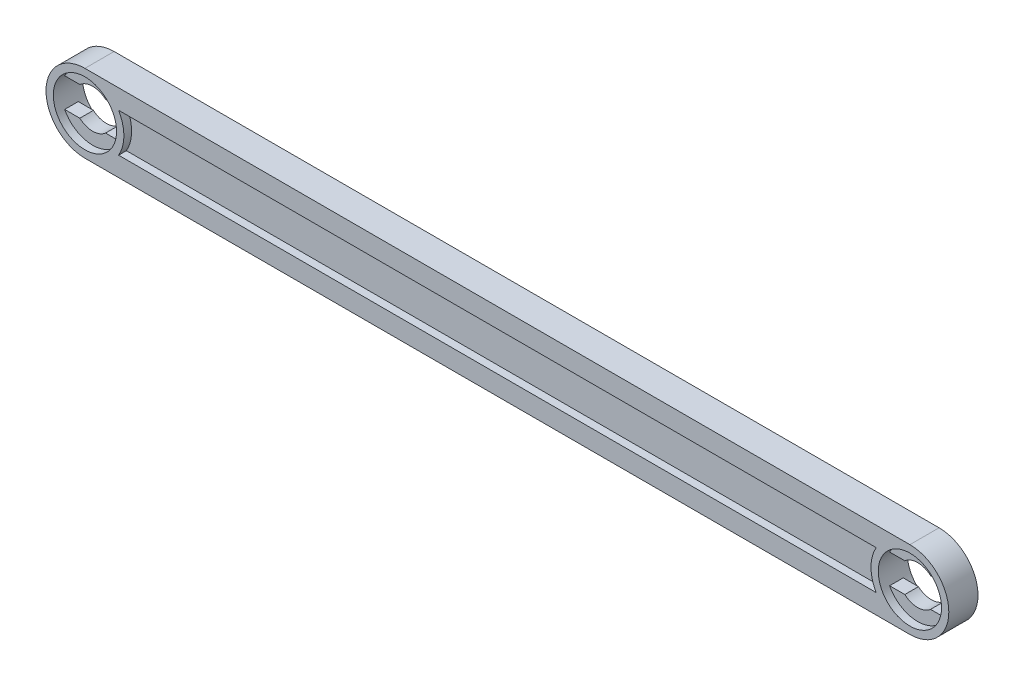
ISO-10303-21;
HEADER;
FILE_DESCRIPTION(('STEP AP214'),'2;1');
FILE_NAME('part.step','',(''),(''),'','','');
FILE_SCHEMA(('AUTOMOTIVE_DESIGN { 1 0 10303 214 1 1 1 1 }'));
ENDSEC;
DATA;
#1=APPLICATION_CONTEXT('core data for automotive mechanical design processes');
#2=APPLICATION_PROTOCOL_DEFINITION('international standard','automotive_design',2000,#1);
#3=PRODUCT_CONTEXT('',#1,'mechanical');
#4=PRODUCT('Part','Part','',(#3));
#5=PRODUCT_RELATED_PRODUCT_CATEGORY('part','',(#4));
#6=PRODUCT_DEFINITION_FORMATION('','',#4);
#7=PRODUCT_DEFINITION_CONTEXT('part definition',#1,'design');
#8=PRODUCT_DEFINITION('design','',#6,#7);
#9=PRODUCT_DEFINITION_SHAPE('','',#8);
#10=(LENGTH_UNIT() NAMED_UNIT(*) SI_UNIT(.MILLI.,.METRE.));
#11=(NAMED_UNIT(*) PLANE_ANGLE_UNIT() SI_UNIT($,.RADIAN.));
#12=(NAMED_UNIT(*) SI_UNIT($,.STERADIAN.) SOLID_ANGLE_UNIT());
#13=UNCERTAINTY_MEASURE_WITH_UNIT(LENGTH_MEASURE(1.E-05),#10,'distance_accuracy_value','');
#14=(GEOMETRIC_REPRESENTATION_CONTEXT(3) GLOBAL_UNCERTAINTY_ASSIGNED_CONTEXT((#13)) GLOBAL_UNIT_ASSIGNED_CONTEXT((#10,
#11,#12)) REPRESENTATION_CONTEXT('',''));
#15=CARTESIAN_POINT('',(0.,0.,0.));
#16=DIRECTION('',(0.,0.,1.));
#17=DIRECTION('',(1.,0.,0.));
#18=AXIS2_PLACEMENT_3D('',#15,#16,#17);
#19=CARTESIAN_POINT('',(0.,0.,-3.));
#20=DIRECTION('',(0.,0.,1.));
#21=DIRECTION('',(1.,0.,0.));
#22=AXIS2_PLACEMENT_3D('',#19,#20,#21);
#23=PLANE('',#22);
#24=DIRECTION('',(0.,-1.,0.));
#25=VECTOR('',#24,1.);
#26=CARTESIAN_POINT('',(80.8,-2.,-3.));
#27=LINE('',#26,#25);
#28=CARTESIAN_POINT('',(80.8,2.,-3.));
#29=VERTEX_POINT('',#28);
#30=CARTESIAN_POINT('',(80.8,-2.,-3.));
#31=VERTEX_POINT('',#30);
#32=EDGE_CURVE('E248',#29,#31,#27,.T.);
#33=ORIENTED_EDGE('',*,*,#32,.F.);
#34=DIRECTION('',(1.,0.,0.));
#35=VECTOR('',#34,1.);
#36=CARTESIAN_POINT('',(80.8,2.,-3.));
#37=LINE('',#36,#35);
#38=CARTESIAN_POINT('',(4.,2.,-3.));
#39=VERTEX_POINT('',#38);
#40=EDGE_CURVE('E49',#39,#29,#37,.T.);
#41=ORIENTED_EDGE('',*,*,#40,.F.);
#42=DIRECTION('',(0.,1.,0.));
#43=VECTOR('',#42,1.);
#44=CARTESIAN_POINT('',(4.00000000000003,-2.,-3.));
#45=LINE('',#44,#43);
#46=CARTESIAN_POINT('',(4.00000000000003,-2.,-3.));
#47=VERTEX_POINT('',#46);
#48=EDGE_CURVE('E239',#47,#39,#45,.T.);
#49=ORIENTED_EDGE('',*,*,#48,.F.);
#50=DIRECTION('',(-1.,0.,0.));
#51=VECTOR('',#50,1.);
#52=CARTESIAN_POINT('',(80.8,-2.,-3.));
#53=LINE('',#52,#51);
#54=EDGE_CURVE('E242',#31,#47,#53,.T.);
#55=ORIENTED_EDGE('',*,*,#54,.F.);
#56=EDGE_LOOP('',(#33,#41,#49,#55));
#57=FACE_BOUND('',#56,.T.);
#58=CARTESIAN_POINT('',(0.,0.,-3.));
#59=DIRECTION('',(0.,0.,1.));
#60=DIRECTION('',(1.,0.,0.));
#61=AXIS2_PLACEMENT_3D('',#58,#59,#60);
#62=CIRCLE('',#61,4.);
#63=CARTESIAN_POINT('',(0.,4.,-3.));
#64=VERTEX_POINT('',#63);
#65=CARTESIAN_POINT('',(0.,-4.,-3.));
#66=VERTEX_POINT('',#65);
#67=EDGE_CURVE('E414',#64,#66,#62,.T.);
#68=ORIENTED_EDGE('',*,*,#67,.F.);
#69=DIRECTION('',(-1.,0.,0.));
#70=VECTOR('',#69,1.);
#71=CARTESIAN_POINT('',(0.,4.,-3.));
#72=LINE('',#71,#70);
#73=CARTESIAN_POINT('',(84.8,4.,-3.));
#74=VERTEX_POINT('',#73);
#75=EDGE_CURVE('E424',#74,#64,#72,.T.);
#76=ORIENTED_EDGE('',*,*,#75,.F.);
#77=CARTESIAN_POINT('',(84.8,0.,-3.));
#78=DIRECTION('',(0.,0.,1.));
#79=DIRECTION('',(1.,0.,0.));
#80=AXIS2_PLACEMENT_3D('',#77,#78,#79);
#81=CIRCLE('',#80,4.);
#82=CARTESIAN_POINT('',(84.8,-4.,-3.));
#83=VERTEX_POINT('',#82);
#84=EDGE_CURVE('E421',#83,#74,#81,.T.);
#85=ORIENTED_EDGE('',*,*,#84,.F.);
#86=DIRECTION('',(1.,0.,0.));
#87=VECTOR('',#86,1.);
#88=CARTESIAN_POINT('',(0.,-4.,-3.));
#89=LINE('',#88,#87);
#90=EDGE_CURVE('E417',#66,#83,#89,.T.);
#91=ORIENTED_EDGE('',*,*,#90,.F.);
#92=EDGE_LOOP('',(#68,#76,#85,#91));
#93=FACE_BOUND('',#92,.T.);
#94=CARTESIAN_POINT('',(0.,0.,-3.));
#95=DIRECTION('',(0.,0.,1.));
#96=DIRECTION('',(1.,0.,0.));
#97=AXIS2_PLACEMENT_3D('',#94,#95,#96);
#98=CIRCLE('',#97,3.25);
#99=CARTESIAN_POINT('',(3.25,0.,-3.));
#100=VERTEX_POINT('',#99);
#101=EDGE_CURVE('E391',#100,#100,#98,.F.);
#102=ORIENTED_EDGE('',*,*,#101,.F.);
#103=EDGE_LOOP('',(#102));
#104=FACE_BOUND('',#103,.T.);
#105=CARTESIAN_POINT('',(84.8,0.,-3.));
#106=DIRECTION('',(0.,0.,1.));
#107=DIRECTION('',(1.,0.,0.));
#108=AXIS2_PLACEMENT_3D('',#105,#106,#107);
#109=CIRCLE('',#108,3.25);
#110=CARTESIAN_POINT('',(88.05,0.,-3.));
#111=VERTEX_POINT('',#110);
#112=EDGE_CURVE('E328',#111,#111,#109,.F.);
#113=ORIENTED_EDGE('',*,*,#112,.F.);
#114=EDGE_LOOP('',(#113));
#115=FACE_BOUND('',#114,.T.);
#116=ADVANCED_FACE('F34',(#57,#93,#104,#115),#23,.F.);
#117=CARTESIAN_POINT('',(81.9168593513323,1.5,-3.001));
#118=DIRECTION('',(0.,1.,0.));
#119=DIRECTION('',(0.,0.,1.));
#120=AXIS2_PLACEMENT_3D('',#117,#118,#119);
#121=PLANE('',#120);
#122=DIRECTION('',(0.,0.,1.));
#123=VECTOR('',#122,1.);
#124=CARTESIAN_POINT('',(81.9168593513323,1.5,-3.001));
#125=LINE('',#124,#123);
#126=CARTESIAN_POINT('',(81.9168593513323,1.5,-2.2));
#127=VERTEX_POINT('',#126);
#128=CARTESIAN_POINT('',(81.9168593513323,1.5,-0.8));
#129=VERTEX_POINT('',#128);
#130=EDGE_CURVE('E335',#127,#129,#125,.T.);
#131=ORIENTED_EDGE('',*,*,#130,.F.);
#132=DIRECTION('',(1.,0.,0.));
#133=VECTOR('',#132,1.);
#134=CARTESIAN_POINT('',(81.9168593513323,1.5,-2.2));
#135=LINE('',#134,#133);
#136=CARTESIAN_POINT('',(83.4771243444677,1.5,-2.2));
#137=VERTEX_POINT('',#136);
#138=EDGE_CURVE('E306',#127,#137,#135,.T.);
#139=ORIENTED_EDGE('',*,*,#138,.T.);
#140=DIRECTION('',(0.,0.,1.));
#141=VECTOR('',#140,1.);
#142=CARTESIAN_POINT('',(83.4771243444677,1.5,-3.001));
#143=LINE('',#142,#141);
#144=CARTESIAN_POINT('',(83.4771243444677,1.5,-0.8));
#145=VERTEX_POINT('',#144);
#146=EDGE_CURVE('E338',#137,#145,#143,.T.);
#147=ORIENTED_EDGE('',*,*,#146,.T.);
#148=DIRECTION('',(1.,0.,0.));
#149=VECTOR('',#148,1.);
#150=CARTESIAN_POINT('',(81.9168593513323,1.5,-0.8));
#151=LINE('',#150,#149);
#152=EDGE_CURVE('E325',#129,#145,#151,.T.);
#153=ORIENTED_EDGE('',*,*,#152,.F.);
#154=EDGE_LOOP('',(#131,#139,#147,#153));
#155=FACE_BOUND('',#154,.T.);
#156=ADVANCED_FACE('F483',(#155),#121,.F.);
#157=CARTESIAN_POINT('',(84.8,0.,-3.001));
#158=DIRECTION('',(0.,0.,1.));
#159=DIRECTION('',(1.,0.,0.));
#160=AXIS2_PLACEMENT_3D('',#157,#158,#159);
#161=CYLINDRICAL_SURFACE('',#160,2.);
#162=ORIENTED_EDGE('',*,*,#146,.F.);
#163=CARTESIAN_POINT('',(84.8,0.,-2.2));
#164=DIRECTION('',(0.,0.,1.));
#165=DIRECTION('',(1.,0.,0.));
#166=AXIS2_PLACEMENT_3D('',#163,#164,#165);
#167=CIRCLE('',#166,2.);
#168=CARTESIAN_POINT('',(86.1228756555323,1.5,-2.2));
#169=VERTEX_POINT('',#168);
#170=EDGE_CURVE('E303',#137,#169,#167,.F.);
#171=ORIENTED_EDGE('',*,*,#170,.T.);
#172=DIRECTION('',(0.,0.,1.));
#173=VECTOR('',#172,1.);
#174=CARTESIAN_POINT('',(86.1228756555323,1.5,-3.001));
#175=LINE('',#174,#173);
#176=CARTESIAN_POINT('',(86.1228756555323,1.5,-0.800000000000001));
#177=VERTEX_POINT('',#176);
#178=EDGE_CURVE('E340',#169,#177,#175,.T.);
#179=ORIENTED_EDGE('',*,*,#178,.T.);
#180=CARTESIAN_POINT('',(84.8,0.,-0.8));
#181=DIRECTION('',(0.,0.,1.));
#182=DIRECTION('',(1.,0.,0.));
#183=AXIS2_PLACEMENT_3D('',#180,#181,#182);
#184=CIRCLE('',#183,2.);
#185=EDGE_CURVE('E322',#145,#177,#184,.F.);
#186=ORIENTED_EDGE('',*,*,#185,.F.);
#187=EDGE_LOOP('',(#162,#171,#179,#186));
#188=FACE_BOUND('',#187,.T.);
#189=ADVANCED_FACE('F489',(#188),#161,.F.);
#190=CARTESIAN_POINT('',(86.1228756555323,1.5,-3.001));
#191=DIRECTION('',(0.,1.,0.));
#192=DIRECTION('',(0.,0.,1.));
#193=AXIS2_PLACEMENT_3D('',#190,#191,#192);
#194=PLANE('',#193);
#195=ORIENTED_EDGE('',*,*,#178,.F.);
#196=DIRECTION('',(1.,0.,0.));
#197=VECTOR('',#196,1.);
#198=CARTESIAN_POINT('',(86.1228756555323,1.5,-2.2));
#199=LINE('',#198,#197);
#200=CARTESIAN_POINT('',(87.6831406486677,1.5,-2.2));
#201=VERTEX_POINT('',#200);
#202=EDGE_CURVE('E300',#169,#201,#199,.T.);
#203=ORIENTED_EDGE('',*,*,#202,.T.);
#204=DIRECTION('',(0.,0.,1.));
#205=VECTOR('',#204,1.);
#206=CARTESIAN_POINT('',(87.6831406486677,1.5,-3.001));
#207=LINE('',#206,#205);
#208=CARTESIAN_POINT('',(87.6831406486677,1.5,-0.8));
#209=VERTEX_POINT('',#208);
#210=EDGE_CURVE('E342',#201,#209,#207,.T.);
#211=ORIENTED_EDGE('',*,*,#210,.T.);
#212=DIRECTION('',(1.,0.,0.));
#213=VECTOR('',#212,1.);
#214=CARTESIAN_POINT('',(86.1228756555323,1.5,-0.8));
#215=LINE('',#214,#213);
#216=EDGE_CURVE('E319',#177,#209,#215,.T.);
#217=ORIENTED_EDGE('',*,*,#216,.F.);
#218=EDGE_LOOP('',(#195,#203,#211,#217));
#219=FACE_BOUND('',#218,.T.);
#220=ADVANCED_FACE('F660',(#219),#194,.F.);
#221=CARTESIAN_POINT('',(86.1228756555323,-1.5,-3.001));
#222=DIRECTION('',(0.,-1.,0.));
#223=DIRECTION('',(0.,0.,-1.));
#224=AXIS2_PLACEMENT_3D('',#221,#222,#223);
#225=PLANE('',#224);
#226=DIRECTION('',(0.,0.,1.));
#227=VECTOR('',#226,1.);
#228=CARTESIAN_POINT('',(87.6831406486677,-1.5,-3.001));
#229=LINE('',#228,#227);
#230=CARTESIAN_POINT('',(87.6831406486677,-1.5,-2.2));
#231=VERTEX_POINT('',#230);
#232=CARTESIAN_POINT('',(87.6831406486677,-1.5,-0.8));
#233=VERTEX_POINT('',#232);
#234=EDGE_CURVE('E344',#231,#233,#229,.T.);
#235=ORIENTED_EDGE('',*,*,#234,.F.);
#236=DIRECTION('',(-1.,0.,0.));
#237=VECTOR('',#236,1.);
#238=CARTESIAN_POINT('',(86.1228756555323,-1.5,-2.2));
#239=LINE('',#238,#237);
#240=CARTESIAN_POINT('',(86.1228756555323,-1.5,-2.2));
#241=VERTEX_POINT('',#240);
#242=EDGE_CURVE('E297',#231,#241,#239,.T.);
#243=ORIENTED_EDGE('',*,*,#242,.T.);
#244=DIRECTION('',(0.,0.,1.));
#245=VECTOR('',#244,1.);
#246=CARTESIAN_POINT('',(86.1228756555323,-1.5,-3.001));
#247=LINE('',#246,#245);
#248=CARTESIAN_POINT('',(86.1228756555323,-1.5,-0.8));
#249=VERTEX_POINT('',#248);
#250=EDGE_CURVE('E346',#241,#249,#247,.T.);
#251=ORIENTED_EDGE('',*,*,#250,.T.);
#252=DIRECTION('',(-1.,0.,0.));
#253=VECTOR('',#252,1.);
#254=CARTESIAN_POINT('',(86.1228756555323,-1.5,-0.8));
#255=LINE('',#254,#253);
#256=EDGE_CURVE('E316',#233,#249,#255,.T.);
#257=ORIENTED_EDGE('',*,*,#256,.F.);
#258=EDGE_LOOP('',(#235,#243,#251,#257));
#259=FACE_BOUND('',#258,.T.);
#260=ADVANCED_FACE('F670',(#259),#225,.F.);
#261=CARTESIAN_POINT('',(84.8,0.,-3.001));
#262=DIRECTION('',(0.,0.,1.));
#263=DIRECTION('',(1.,0.,0.));
#264=AXIS2_PLACEMENT_3D('',#261,#262,#263);
#265=CYLINDRICAL_SURFACE('',#264,2.);
#266=ORIENTED_EDGE('',*,*,#250,.F.);
#267=CARTESIAN_POINT('',(84.8,0.,-2.2));
#268=DIRECTION('',(0.,0.,1.));
#269=DIRECTION('',(1.,0.,0.));
#270=AXIS2_PLACEMENT_3D('',#267,#268,#269);
#271=CIRCLE('',#270,2.);
#272=CARTESIAN_POINT('',(83.4771243444677,-1.5,-2.2));
#273=VERTEX_POINT('',#272);
#274=EDGE_CURVE('E294',#241,#273,#271,.F.);
#275=ORIENTED_EDGE('',*,*,#274,.T.);
#276=DIRECTION('',(0.,0.,1.));
#277=VECTOR('',#276,1.);
#278=CARTESIAN_POINT('',(83.4771243444677,-1.5,-3.001));
#279=LINE('',#278,#277);
#280=CARTESIAN_POINT('',(83.4771243444677,-1.5,-0.800000000000001));
#281=VERTEX_POINT('',#280);
#282=EDGE_CURVE('E348',#273,#281,#279,.T.);
#283=ORIENTED_EDGE('',*,*,#282,.T.);
#284=CARTESIAN_POINT('',(84.8,0.,-0.8));
#285=DIRECTION('',(0.,0.,1.));
#286=DIRECTION('',(1.,0.,0.));
#287=AXIS2_PLACEMENT_3D('',#284,#285,#286);
#288=CIRCLE('',#287,2.);
#289=EDGE_CURVE('E313',#249,#281,#288,.F.);
#290=ORIENTED_EDGE('',*,*,#289,.F.);
#291=EDGE_LOOP('',(#266,#275,#283,#290));
#292=FACE_BOUND('',#291,.T.);
#293=ADVANCED_FACE('F680',(#292),#265,.F.);
#294=CARTESIAN_POINT('',(81.9168593513323,-1.5,-3.001));
#295=DIRECTION('',(0.,-1.,0.));
#296=DIRECTION('',(0.,0.,-1.));
#297=AXIS2_PLACEMENT_3D('',#294,#295,#296);
#298=PLANE('',#297);
#299=ORIENTED_EDGE('',*,*,#282,.F.);
#300=DIRECTION('',(-1.,0.,0.));
#301=VECTOR('',#300,1.);
#302=CARTESIAN_POINT('',(81.9168593513323,-1.5,-2.2));
#303=LINE('',#302,#301);
#304=CARTESIAN_POINT('',(81.9168593513323,-1.5,-2.2));
#305=VERTEX_POINT('',#304);
#306=EDGE_CURVE('E291',#273,#305,#303,.T.);
#307=ORIENTED_EDGE('',*,*,#306,.T.);
#308=DIRECTION('',(0.,0.,1.));
#309=VECTOR('',#308,1.);
#310=CARTESIAN_POINT('',(81.9168593513323,-1.5,-3.001));
#311=LINE('',#310,#309);
#312=CARTESIAN_POINT('',(81.9168593513323,-1.5,-0.8));
#313=VERTEX_POINT('',#312);
#314=EDGE_CURVE('E334',#305,#313,#311,.T.);
#315=ORIENTED_EDGE('',*,*,#314,.T.);
#316=DIRECTION('',(-1.,0.,0.));
#317=VECTOR('',#316,1.);
#318=CARTESIAN_POINT('',(81.9168593513323,-1.5,-0.8));
#319=LINE('',#318,#317);
#320=EDGE_CURVE('E11',#281,#313,#319,.T.);
#321=ORIENTED_EDGE('',*,*,#320,.F.);
#322=EDGE_LOOP('',(#299,#307,#315,#321));
#323=FACE_BOUND('',#322,.T.);
#324=ADVANCED_FACE('F602',(#323),#298,.F.);
#325=CARTESIAN_POINT('',(-2.8831406486677,1.5,-3.001));
#326=DIRECTION('',(0.,1.,0.));
#327=DIRECTION('',(0.,0.,1.));
#328=AXIS2_PLACEMENT_3D('',#325,#326,#327);
#329=PLANE('',#328);
#330=DIRECTION('',(0.,0.,1.));
#331=VECTOR('',#330,1.);
#332=CARTESIAN_POINT('',(-2.8831406486677,1.5,-3.001));
#333=LINE('',#332,#331);
#334=CARTESIAN_POINT('',(-2.8831406486677,1.5,-2.2));
#335=VERTEX_POINT('',#334);
#336=CARTESIAN_POINT('',(-2.8831406486677,1.5,-0.8));
#337=VERTEX_POINT('',#336);
#338=EDGE_CURVE('E398',#335,#337,#333,.T.);
#339=ORIENTED_EDGE('',*,*,#338,.F.);
#340=DIRECTION('',(1.,0.,0.));
#341=VECTOR('',#340,1.);
#342=CARTESIAN_POINT('',(-2.8831406486677,1.5,-2.2));
#343=LINE('',#342,#341);
#344=CARTESIAN_POINT('',(-1.3228756555323,1.5,-2.2));
#345=VERTEX_POINT('',#344);
#346=EDGE_CURVE('E369',#335,#345,#343,.T.);
#347=ORIENTED_EDGE('',*,*,#346,.T.);
#348=DIRECTION('',(0.,0.,1.));
#349=VECTOR('',#348,1.);
#350=CARTESIAN_POINT('',(-1.3228756555323,1.5,-3.001));
#351=LINE('',#350,#349);
#352=CARTESIAN_POINT('',(-1.3228756555323,1.5,-0.8));
#353=VERTEX_POINT('',#352);
#354=EDGE_CURVE('E401',#345,#353,#351,.T.);
#355=ORIENTED_EDGE('',*,*,#354,.T.);
#356=DIRECTION('',(1.,0.,0.));
#357=VECTOR('',#356,1.);
#358=CARTESIAN_POINT('',(-2.8831406486677,1.5,-0.8));
#359=LINE('',#358,#357);
#360=EDGE_CURVE('E388',#337,#353,#359,.T.);
#361=ORIENTED_EDGE('',*,*,#360,.F.);
#362=EDGE_LOOP('',(#339,#347,#355,#361));
#363=FACE_BOUND('',#362,.T.);
#364=ADVANCED_FACE('F538',(#363),#329,.F.);
#365=CARTESIAN_POINT('',(0.,0.,-3.001));
#366=DIRECTION('',(0.,0.,1.));
#367=DIRECTION('',(1.,0.,0.));
#368=AXIS2_PLACEMENT_3D('',#365,#366,#367);
#369=CYLINDRICAL_SURFACE('',#368,2.);
#370=ORIENTED_EDGE('',*,*,#354,.F.);
#371=CARTESIAN_POINT('',(0.,0.,-2.2));
#372=DIRECTION('',(0.,0.,1.));
#373=DIRECTION('',(1.,0.,0.));
#374=AXIS2_PLACEMENT_3D('',#371,#372,#373);
#375=CIRCLE('',#374,2.);
#376=CARTESIAN_POINT('',(1.3228756555323,1.5,-2.2));
#377=VERTEX_POINT('',#376);
#378=EDGE_CURVE('E366',#345,#377,#375,.F.);
#379=ORIENTED_EDGE('',*,*,#378,.T.);
#380=DIRECTION('',(0.,0.,1.));
#381=VECTOR('',#380,1.);
#382=CARTESIAN_POINT('',(1.3228756555323,1.5,-3.001));
#383=LINE('',#382,#381);
#384=CARTESIAN_POINT('',(1.3228756555323,1.5,-0.800000000000001));
#385=VERTEX_POINT('',#384);
#386=EDGE_CURVE('E403',#377,#385,#383,.T.);
#387=ORIENTED_EDGE('',*,*,#386,.T.);
#388=CARTESIAN_POINT('',(0.,0.,-0.8));
#389=DIRECTION('',(0.,0.,1.));
#390=DIRECTION('',(1.,0.,0.));
#391=AXIS2_PLACEMENT_3D('',#388,#389,#390);
#392=CIRCLE('',#391,2.);
#393=EDGE_CURVE('E385',#353,#385,#392,.F.);
#394=ORIENTED_EDGE('',*,*,#393,.F.);
#395=EDGE_LOOP('',(#370,#379,#387,#394));
#396=FACE_BOUND('',#395,.T.);
#397=ADVANCED_FACE('F544',(#396),#369,.F.);
#398=CARTESIAN_POINT('',(1.3228756555323,1.5,-3.001));
#399=DIRECTION('',(0.,1.,0.));
#400=DIRECTION('',(0.,0.,1.));
#401=AXIS2_PLACEMENT_3D('',#398,#399,#400);
#402=PLANE('',#401);
#403=ORIENTED_EDGE('',*,*,#386,.F.);
#404=DIRECTION('',(1.,0.,0.));
#405=VECTOR('',#404,1.);
#406=CARTESIAN_POINT('',(1.3228756555323,1.5,-2.2));
#407=LINE('',#406,#405);
#408=CARTESIAN_POINT('',(2.8831406486677,1.5,-2.2));
#409=VERTEX_POINT('',#408);
#410=EDGE_CURVE('E363',#377,#409,#407,.T.);
#411=ORIENTED_EDGE('',*,*,#410,.T.);
#412=DIRECTION('',(0.,0.,1.));
#413=VECTOR('',#412,1.);
#414=CARTESIAN_POINT('',(2.8831406486677,1.5,-3.001));
#415=LINE('',#414,#413);
#416=CARTESIAN_POINT('',(2.8831406486677,1.5,-0.8));
#417=VERTEX_POINT('',#416);
#418=EDGE_CURVE('E405',#409,#417,#415,.T.);
#419=ORIENTED_EDGE('',*,*,#418,.T.);
#420=DIRECTION('',(1.,0.,0.));
#421=VECTOR('',#420,1.);
#422=CARTESIAN_POINT('',(1.3228756555323,1.5,-0.8));
#423=LINE('',#422,#421);
#424=EDGE_CURVE('E382',#385,#417,#423,.T.);
#425=ORIENTED_EDGE('',*,*,#424,.F.);
#426=EDGE_LOOP('',(#403,#411,#419,#425));
#427=FACE_BOUND('',#426,.T.);
#428=ADVANCED_FACE('F547',(#427),#402,.F.);
#429=CARTESIAN_POINT('',(1.3228756555323,-1.5,-3.001));
#430=DIRECTION('',(0.,-1.,0.));
#431=DIRECTION('',(0.,0.,-1.));
#432=AXIS2_PLACEMENT_3D('',#429,#430,#431);
#433=PLANE('',#432);
#434=DIRECTION('',(0.,0.,1.));
#435=VECTOR('',#434,1.);
#436=CARTESIAN_POINT('',(2.8831406486677,-1.5,-3.001));
#437=LINE('',#436,#435);
#438=CARTESIAN_POINT('',(2.8831406486677,-1.5,-2.2));
#439=VERTEX_POINT('',#438);
#440=CARTESIAN_POINT('',(2.8831406486677,-1.5,-0.8));
#441=VERTEX_POINT('',#440);
#442=EDGE_CURVE('E407',#439,#441,#437,.T.);
#443=ORIENTED_EDGE('',*,*,#442,.F.);
#444=DIRECTION('',(-1.,0.,0.));
#445=VECTOR('',#444,1.);
#446=CARTESIAN_POINT('',(1.3228756555323,-1.5,-2.2));
#447=LINE('',#446,#445);
#448=CARTESIAN_POINT('',(1.32287565553229,-1.5,-2.2));
#449=VERTEX_POINT('',#448);
#450=EDGE_CURVE('E360',#439,#449,#447,.T.);
#451=ORIENTED_EDGE('',*,*,#450,.T.);
#452=DIRECTION('',(0.,0.,1.));
#453=VECTOR('',#452,1.);
#454=CARTESIAN_POINT('',(1.32287565553229,-1.5,-3.001));
#455=LINE('',#454,#453);
#456=CARTESIAN_POINT('',(1.32287565553229,-1.5,-0.8));
#457=VERTEX_POINT('',#456);
#458=EDGE_CURVE('E409',#449,#457,#455,.T.);
#459=ORIENTED_EDGE('',*,*,#458,.T.);
#460=DIRECTION('',(-1.,0.,0.));
#461=VECTOR('',#460,1.);
#462=CARTESIAN_POINT('',(1.3228756555323,-1.5,-0.8));
#463=LINE('',#462,#461);
#464=EDGE_CURVE('E379',#441,#457,#463,.T.);
#465=ORIENTED_EDGE('',*,*,#464,.F.);
#466=EDGE_LOOP('',(#443,#451,#459,#465));
#467=FACE_BOUND('',#466,.T.);
#468=ADVANCED_FACE('F461',(#467),#433,.F.);
#469=CARTESIAN_POINT('',(0.,0.,-3.001));
#470=DIRECTION('',(0.,0.,1.));
#471=DIRECTION('',(1.,0.,0.));
#472=AXIS2_PLACEMENT_3D('',#469,#470,#471);
#473=CYLINDRICAL_SURFACE('',#472,2.);
#474=ORIENTED_EDGE('',*,*,#458,.F.);
#475=CARTESIAN_POINT('',(0.,0.,-2.2));
#476=DIRECTION('',(0.,0.,1.));
#477=DIRECTION('',(1.,0.,0.));
#478=AXIS2_PLACEMENT_3D('',#475,#476,#477);
#479=CIRCLE('',#478,2.);
#480=CARTESIAN_POINT('',(-1.3228756555323,-1.5,-2.2));
#481=VERTEX_POINT('',#480);
#482=EDGE_CURVE('E357',#449,#481,#479,.F.);
#483=ORIENTED_EDGE('',*,*,#482,.T.);
#484=DIRECTION('',(0.,0.,1.));
#485=VECTOR('',#484,1.);
#486=CARTESIAN_POINT('',(-1.3228756555323,-1.5,-3.001));
#487=LINE('',#486,#485);
#488=CARTESIAN_POINT('',(-1.3228756555323,-1.5,-0.800000000000001));
#489=VERTEX_POINT('',#488);
#490=EDGE_CURVE('E411',#481,#489,#487,.T.);
#491=ORIENTED_EDGE('',*,*,#490,.T.);
#492=CARTESIAN_POINT('',(0.,0.,-0.8));
#493=DIRECTION('',(0.,0.,1.));
#494=DIRECTION('',(1.,0.,0.));
#495=AXIS2_PLACEMENT_3D('',#492,#493,#494);
#496=CIRCLE('',#495,2.);
#497=EDGE_CURVE('E376',#457,#489,#496,.F.);
#498=ORIENTED_EDGE('',*,*,#497,.F.);
#499=EDGE_LOOP('',(#474,#483,#491,#498));
#500=FACE_BOUND('',#499,.T.);
#501=ADVANCED_FACE('F464',(#500),#473,.F.);
#502=CARTESIAN_POINT('',(-2.8831406486677,-1.5,-3.001));
#503=DIRECTION('',(0.,-1.,0.));
#504=DIRECTION('',(0.,0.,-1.));
#505=AXIS2_PLACEMENT_3D('',#502,#503,#504);
#506=PLANE('',#505);
#507=ORIENTED_EDGE('',*,*,#490,.F.);
#508=DIRECTION('',(-1.,0.,0.));
#509=VECTOR('',#508,1.);
#510=CARTESIAN_POINT('',(-2.8831406486677,-1.5,-2.2));
#511=LINE('',#510,#509);
#512=CARTESIAN_POINT('',(-2.8831406486677,-1.5,-2.2));
#513=VERTEX_POINT('',#512);
#514=EDGE_CURVE('E354',#481,#513,#511,.T.);
#515=ORIENTED_EDGE('',*,*,#514,.T.);
#516=DIRECTION('',(0.,0.,1.));
#517=VECTOR('',#516,1.);
#518=CARTESIAN_POINT('',(-2.8831406486677,-1.5,-3.001));
#519=LINE('',#518,#517);
#520=CARTESIAN_POINT('',(-2.8831406486677,-1.5,-0.8));
#521=VERTEX_POINT('',#520);
#522=EDGE_CURVE('E397',#513,#521,#519,.T.);
#523=ORIENTED_EDGE('',*,*,#522,.T.);
#524=DIRECTION('',(-1.,0.,0.));
#525=VECTOR('',#524,1.);
#526=CARTESIAN_POINT('',(-2.8831406486677,-1.5,-0.8));
#527=LINE('',#526,#525);
#528=EDGE_CURVE('E42',#489,#521,#527,.T.);
#529=ORIENTED_EDGE('',*,*,#528,.F.);
#530=EDGE_LOOP('',(#507,#515,#523,#529));
#531=FACE_BOUND('',#530,.T.);
#532=ADVANCED_FACE('F465',(#531),#506,.F.);
#533=CARTESIAN_POINT('',(0.,0.,-3.));
#534=DIRECTION('',(0.,0.,1.));
#535=DIRECTION('',(1.,0.,0.));
#536=AXIS2_PLACEMENT_3D('',#533,#534,#535);
#537=CYLINDRICAL_SURFACE('',#536,4.);
#538=CARTESIAN_POINT('',(0.,0.,0.));
#539=DIRECTION('',(0.,0.,1.));
#540=DIRECTION('',(1.,0.,0.));
#541=AXIS2_PLACEMENT_3D('',#538,#539,#540);
#542=CIRCLE('',#541,4.);
#543=CARTESIAN_POINT('',(0.,4.,0.));
#544=VERTEX_POINT('',#543);
#545=CARTESIAN_POINT('',(0.,-4.,0.));
#546=VERTEX_POINT('',#545);
#547=EDGE_CURVE('E400',#544,#546,#542,.T.);
#548=ORIENTED_EDGE('',*,*,#547,.F.);
#549=DIRECTION('',(0.,0.,1.));
#550=VECTOR('',#549,1.);
#551=CARTESIAN_POINT('',(0.,4.,-3.));
#552=LINE('',#551,#550);
#553=EDGE_CURVE('E438',#64,#544,#552,.T.);
#554=ORIENTED_EDGE('',*,*,#553,.F.);
#555=ORIENTED_EDGE('',*,*,#67,.T.);
#556=DIRECTION('',(0.,0.,1.));
#557=VECTOR('',#556,1.);
#558=CARTESIAN_POINT('',(0.,-4.,-3.));
#559=LINE('',#558,#557);
#560=EDGE_CURVE('E427',#66,#546,#559,.T.);
#561=ORIENTED_EDGE('',*,*,#560,.T.);
#562=EDGE_LOOP('',(#548,#554,#555,#561));
#563=FACE_BOUND('',#562,.T.);
#564=ADVANCED_FACE('F36',(#563),#537,.T.);
#565=CARTESIAN_POINT('',(0.,4.,-3.));
#566=DIRECTION('',(0.,1.,0.));
#567=DIRECTION('',(0.,0.,1.));
#568=AXIS2_PLACEMENT_3D('',#565,#566,#567);
#569=PLANE('',#568);
#570=DIRECTION('',(-1.,0.,0.));
#571=VECTOR('',#570,1.);
#572=CARTESIAN_POINT('',(0.,4.,0.));
#573=LINE('',#572,#571);
#574=CARTESIAN_POINT('',(84.8,4.,0.));
#575=VERTEX_POINT('',#574);
#576=EDGE_CURVE('E418',#575,#544,#573,.T.);
#577=ORIENTED_EDGE('',*,*,#576,.F.);
#578=DIRECTION('',(0.,0.,1.));
#579=VECTOR('',#578,1.);
#580=CARTESIAN_POINT('',(84.8,4.,-3.));
#581=LINE('',#580,#579);
#582=EDGE_CURVE('E440',#74,#575,#581,.T.);
#583=ORIENTED_EDGE('',*,*,#582,.F.);
#584=ORIENTED_EDGE('',*,*,#75,.T.);
#585=ORIENTED_EDGE('',*,*,#553,.T.);
#586=EDGE_LOOP('',(#577,#583,#584,#585));
#587=FACE_BOUND('',#586,.T.);
#588=ADVANCED_FACE('F501',(#587),#569,.T.);
#589=CARTESIAN_POINT('',(84.8,0.,-3.));
#590=DIRECTION('',(0.,0.,1.));
#591=DIRECTION('',(1.,0.,0.));
#592=AXIS2_PLACEMENT_3D('',#589,#590,#591);
#593=CYLINDRICAL_SURFACE('',#592,4.);
#594=CARTESIAN_POINT('',(84.8,0.,0.));
#595=DIRECTION('',(0.,0.,1.));
#596=DIRECTION('',(1.,0.,0.));
#597=AXIS2_PLACEMENT_3D('',#594,#595,#596);
#598=CIRCLE('',#597,4.);
#599=CARTESIAN_POINT('',(84.8,-4.,0.));
#600=VERTEX_POINT('',#599);
#601=EDGE_CURVE('E433',#600,#575,#598,.T.);
#602=ORIENTED_EDGE('',*,*,#601,.F.);
#603=DIRECTION('',(0.,0.,1.));
#604=VECTOR('',#603,1.);
#605=CARTESIAN_POINT('',(84.8,-4.,-3.));
#606=LINE('',#605,#604);
#607=EDGE_CURVE('E442',#83,#600,#606,.T.);
#608=ORIENTED_EDGE('',*,*,#607,.F.);
#609=ORIENTED_EDGE('',*,*,#84,.T.);
#610=ORIENTED_EDGE('',*,*,#582,.T.);
#611=EDGE_LOOP('',(#602,#608,#609,#610));
#612=FACE_BOUND('',#611,.T.);
#613=ADVANCED_FACE('F504',(#612),#593,.T.);
#614=CARTESIAN_POINT('',(0.,-4.,-3.));
#615=DIRECTION('',(0.,-1.,0.));
#616=DIRECTION('',(0.,0.,-1.));
#617=AXIS2_PLACEMENT_3D('',#614,#615,#616);
#618=PLANE('',#617);
#619=DIRECTION('',(1.,0.,0.));
#620=VECTOR('',#619,1.);
#621=CARTESIAN_POINT('',(0.,-4.,0.));
#622=LINE('',#621,#620);
#623=EDGE_CURVE('E430',#546,#600,#622,.T.);
#624=ORIENTED_EDGE('',*,*,#623,.F.);
#625=ORIENTED_EDGE('',*,*,#560,.F.);
#626=ORIENTED_EDGE('',*,*,#90,.T.);
#627=ORIENTED_EDGE('',*,*,#607,.T.);
#628=EDGE_LOOP('',(#624,#625,#626,#627));
#629=FACE_BOUND('',#628,.T.);
#630=ADVANCED_FACE('F499',(#629),#618,.T.);
#631=CARTESIAN_POINT('',(0.,0.,0.));
#632=DIRECTION('',(0.,0.,1.));
#633=DIRECTION('',(1.,0.,0.));
#634=AXIS2_PLACEMENT_3D('',#631,#632,#633);
#635=PLANE('',#634);
#636=CARTESIAN_POINT('',(0.,0.,0.));
#637=DIRECTION('',(0.,0.,-1.));
#638=DIRECTION('',(1.,0.,0.));
#639=AXIS2_PLACEMENT_3D('',#636,#637,#638);
#640=CIRCLE('',#639,4.);
#641=CARTESIAN_POINT('',(3.46410161513775,2.,0.));
#642=VERTEX_POINT('',#641);
#643=CARTESIAN_POINT('',(3.46410161513775,-2.,0.));
#644=VERTEX_POINT('',#643);
#645=EDGE_CURVE('E57',#642,#644,#640,.T.);
#646=ORIENTED_EDGE('',*,*,#645,.F.);
#647=DIRECTION('',(-1.,0.,0.));
#648=VECTOR('',#647,1.);
#649=CARTESIAN_POINT('',(3.46410161513775,2.,0.));
#650=LINE('',#649,#648);
#651=CARTESIAN_POINT('',(81.3358983848622,2.00000000000001,0.));
#652=VERTEX_POINT('',#651);
#653=EDGE_CURVE('E261',#652,#642,#650,.T.);
#654=ORIENTED_EDGE('',*,*,#653,.F.);
#655=CARTESIAN_POINT('',(84.8,0.,0.));
#656=DIRECTION('',(0.,0.,-1.));
#657=DIRECTION('',(1.,0.,0.));
#658=AXIS2_PLACEMENT_3D('',#655,#656,#657);
#659=CIRCLE('',#658,4.00000000000001);
#660=CARTESIAN_POINT('',(81.3358983848622,-2.00000000000001,0.));
#661=VERTEX_POINT('',#660);
#662=EDGE_CURVE('E275',#661,#652,#659,.T.);
#663=ORIENTED_EDGE('',*,*,#662,.F.);
#664=DIRECTION('',(1.,0.,0.));
#665=VECTOR('',#664,1.);
#666=CARTESIAN_POINT('',(3.46410161513775,-2.,0.));
#667=LINE('',#666,#665);
#668=EDGE_CURVE('E272',#644,#661,#667,.T.);
#669=ORIENTED_EDGE('',*,*,#668,.F.);
#670=EDGE_LOOP('',(#646,#654,#663,#669));
#671=FACE_BOUND('',#670,.T.);
#672=CARTESIAN_POINT('',(84.8,0.,0.));
#673=DIRECTION('',(0.,0.,1.));
#674=DIRECTION('',(1.,0.,0.));
#675=AXIS2_PLACEMENT_3D('',#672,#673,#674);
#676=CIRCLE('',#675,3.25);
#677=CARTESIAN_POINT('',(88.05,0.,0.));
#678=VERTEX_POINT('',#677);
#679=EDGE_CURVE('E331',#678,#678,#676,.T.);
#680=ORIENTED_EDGE('',*,*,#679,.F.);
#681=EDGE_LOOP('',(#680));
#682=FACE_BOUND('',#681,.T.);
#683=CARTESIAN_POINT('',(0.,0.,0.));
#684=DIRECTION('',(0.,0.,1.));
#685=DIRECTION('',(1.,0.,0.));
#686=AXIS2_PLACEMENT_3D('',#683,#684,#685);
#687=CIRCLE('',#686,3.25);
#688=CARTESIAN_POINT('',(3.25,0.,0.));
#689=VERTEX_POINT('',#688);
#690=EDGE_CURVE('E394',#689,#689,#687,.T.);
#691=ORIENTED_EDGE('',*,*,#690,.F.);
#692=EDGE_LOOP('',(#691));
#693=FACE_BOUND('',#692,.T.);
#694=ORIENTED_EDGE('',*,*,#547,.T.);
#695=ORIENTED_EDGE('',*,*,#623,.T.);
#696=ORIENTED_EDGE('',*,*,#601,.T.);
#697=ORIENTED_EDGE('',*,*,#576,.T.);
#698=EDGE_LOOP('',(#694,#695,#696,#697));
#699=FACE_BOUND('',#698,.T.);
#700=ADVANCED_FACE('F496',(#671,#682,#693,#699),#635,.T.);
#701=CARTESIAN_POINT('',(0.,0.,-3.001));
#702=DIRECTION('',(0.,0.,1.));
#703=DIRECTION('',(1.,0.,0.));
#704=AXIS2_PLACEMENT_3D('',#701,#702,#703);
#705=CYLINDRICAL_SURFACE('',#704,3.25);
#706=CARTESIAN_POINT('',(0.,0.,-2.2));
#707=DIRECTION('',(0.,0.,1.));
#708=DIRECTION('',(1.,0.,0.));
#709=AXIS2_PLACEMENT_3D('',#706,#707,#708);
#710=CIRCLE('',#709,3.25);
#711=EDGE_CURVE('E351',#409,#335,#710,.T.);
#712=ORIENTED_EDGE('',*,*,#711,.T.);
#713=ORIENTED_EDGE('',*,*,#338,.T.);
#714=CARTESIAN_POINT('',(0.,0.,-0.8));
#715=DIRECTION('',(0.,0.,1.));
#716=DIRECTION('',(1.,0.,0.));
#717=AXIS2_PLACEMENT_3D('',#714,#715,#716);
#718=CIRCLE('',#717,3.25);
#719=EDGE_CURVE('E373',#417,#337,#718,.T.);
#720=ORIENTED_EDGE('',*,*,#719,.F.);
#721=ORIENTED_EDGE('',*,*,#418,.F.);
#722=EDGE_LOOP('',(#712,#713,#720,#721));
#723=FACE_BOUND('',#722,.T.);
#724=EDGE_CURVE('E337',#513,#439,#710,.T.);
#725=ORIENTED_EDGE('',*,*,#724,.T.);
#726=ORIENTED_EDGE('',*,*,#442,.T.);
#727=EDGE_CURVE('E372',#521,#441,#718,.T.);
#728=ORIENTED_EDGE('',*,*,#727,.F.);
#729=ORIENTED_EDGE('',*,*,#522,.F.);
#730=EDGE_LOOP('',(#725,#726,#728,#729));
#731=FACE_BOUND('',#730,.T.);
#732=ORIENTED_EDGE('',*,*,#690,.T.);
#733=EDGE_LOOP('',(#732));
#734=FACE_BOUND('',#733,.T.);
#735=ORIENTED_EDGE('',*,*,#101,.T.);
#736=EDGE_LOOP('',(#735));
#737=FACE_BOUND('',#736,.T.);
#738=ADVANCED_FACE('F457',(#723,#731,#734,#737),#705,.F.);
#739=CARTESIAN_POINT('',(0.,0.,-0.8));
#740=DIRECTION('',(0.,0.,1.));
#741=DIRECTION('',(1.,0.,0.));
#742=AXIS2_PLACEMENT_3D('',#739,#740,#741);
#743=PLANE('',#742);
#744=ORIENTED_EDGE('',*,*,#464,.T.);
#745=ORIENTED_EDGE('',*,*,#497,.T.);
#746=ORIENTED_EDGE('',*,*,#528,.T.);
#747=ORIENTED_EDGE('',*,*,#727,.T.);
#748=EDGE_LOOP('',(#744,#745,#746,#747));
#749=FACE_BOUND('',#748,.T.);
#750=ADVANCED_FACE('F449',(#749),#743,.T.);
#751=ORIENTED_EDGE('',*,*,#360,.T.);
#752=ORIENTED_EDGE('',*,*,#393,.T.);
#753=ORIENTED_EDGE('',*,*,#424,.T.);
#754=ORIENTED_EDGE('',*,*,#719,.T.);
#755=EDGE_LOOP('',(#751,#752,#753,#754));
#756=FACE_BOUND('',#755,.T.);
#757=ADVANCED_FACE('F479',(#756),#743,.T.);
#758=CARTESIAN_POINT('',(0.,0.,-2.2));
#759=DIRECTION('',(0.,0.,1.));
#760=DIRECTION('',(1.,0.,0.));
#761=AXIS2_PLACEMENT_3D('',#758,#759,#760);
#762=PLANE('',#761);
#763=ORIENTED_EDGE('',*,*,#711,.F.);
#764=ORIENTED_EDGE('',*,*,#410,.F.);
#765=ORIENTED_EDGE('',*,*,#378,.F.);
#766=ORIENTED_EDGE('',*,*,#346,.F.);
#767=EDGE_LOOP('',(#763,#764,#765,#766));
#768=FACE_BOUND('',#767,.T.);
#769=ADVANCED_FACE('F470',(#768),#762,.F.);
#770=ORIENTED_EDGE('',*,*,#724,.F.);
#771=ORIENTED_EDGE('',*,*,#514,.F.);
#772=ORIENTED_EDGE('',*,*,#482,.F.);
#773=ORIENTED_EDGE('',*,*,#450,.F.);
#774=EDGE_LOOP('',(#770,#771,#772,#773));
#775=FACE_BOUND('',#774,.T.);
#776=ADVANCED_FACE('F467',(#775),#762,.F.);
#777=CARTESIAN_POINT('',(84.8,0.,-3.001));
#778=DIRECTION('',(0.,0.,1.));
#779=DIRECTION('',(1.,0.,0.));
#780=AXIS2_PLACEMENT_3D('',#777,#778,#779);
#781=CYLINDRICAL_SURFACE('',#780,3.25);
#782=CARTESIAN_POINT('',(84.8,0.,-2.2));
#783=DIRECTION('',(0.,0.,1.));
#784=DIRECTION('',(1.,0.,0.));
#785=AXIS2_PLACEMENT_3D('',#782,#783,#784);
#786=CIRCLE('',#785,3.25);
#787=EDGE_CURVE('E288',#201,#127,#786,.T.);
#788=ORIENTED_EDGE('',*,*,#787,.T.);
#789=ORIENTED_EDGE('',*,*,#130,.T.);
#790=CARTESIAN_POINT('',(84.8,0.,-0.8));
#791=DIRECTION('',(0.,0.,1.));
#792=DIRECTION('',(1.,0.,0.));
#793=AXIS2_PLACEMENT_3D('',#790,#791,#792);
#794=CIRCLE('',#793,3.25);
#795=EDGE_CURVE('E310',#209,#129,#794,.T.);
#796=ORIENTED_EDGE('',*,*,#795,.F.);
#797=ORIENTED_EDGE('',*,*,#210,.F.);
#798=EDGE_LOOP('',(#788,#789,#796,#797));
#799=FACE_BOUND('',#798,.T.);
#800=EDGE_CURVE('E282',#305,#231,#786,.T.);
#801=ORIENTED_EDGE('',*,*,#800,.T.);
#802=ORIENTED_EDGE('',*,*,#234,.T.);
#803=EDGE_CURVE('E309',#313,#233,#794,.T.);
#804=ORIENTED_EDGE('',*,*,#803,.F.);
#805=ORIENTED_EDGE('',*,*,#314,.F.);
#806=EDGE_LOOP('',(#801,#802,#804,#805));
#807=FACE_BOUND('',#806,.T.);
#808=ORIENTED_EDGE('',*,*,#679,.T.);
#809=EDGE_LOOP('',(#808));
#810=FACE_BOUND('',#809,.T.);
#811=ORIENTED_EDGE('',*,*,#112,.T.);
#812=EDGE_LOOP('',(#811));
#813=FACE_BOUND('',#812,.T.);
#814=ADVANCED_FACE('F469',(#799,#807,#810,#813),#781,.F.);
#815=CARTESIAN_POINT('',(84.8,0.,-0.8));
#816=DIRECTION('',(0.,0.,1.));
#817=DIRECTION('',(1.,0.,0.));
#818=AXIS2_PLACEMENT_3D('',#815,#816,#817);
#819=PLANE('',#818);
#820=ORIENTED_EDGE('',*,*,#256,.T.);
#821=ORIENTED_EDGE('',*,*,#289,.T.);
#822=ORIENTED_EDGE('',*,*,#320,.T.);
#823=ORIENTED_EDGE('',*,*,#803,.T.);
#824=EDGE_LOOP('',(#820,#821,#822,#823));
#825=FACE_BOUND('',#824,.T.);
#826=ADVANCED_FACE('F476',(#825),#819,.T.);
#827=ORIENTED_EDGE('',*,*,#152,.T.);
#828=ORIENTED_EDGE('',*,*,#185,.T.);
#829=ORIENTED_EDGE('',*,*,#216,.T.);
#830=ORIENTED_EDGE('',*,*,#795,.T.);
#831=EDGE_LOOP('',(#827,#828,#829,#830));
#832=FACE_BOUND('',#831,.T.);
#833=ADVANCED_FACE('F716',(#832),#819,.T.);
#834=CARTESIAN_POINT('',(84.8,0.,-2.2));
#835=DIRECTION('',(0.,0.,1.));
#836=DIRECTION('',(1.,0.,0.));
#837=AXIS2_PLACEMENT_3D('',#834,#835,#836);
#838=PLANE('',#837);
#839=ORIENTED_EDGE('',*,*,#787,.F.);
#840=ORIENTED_EDGE('',*,*,#202,.F.);
#841=ORIENTED_EDGE('',*,*,#170,.F.);
#842=ORIENTED_EDGE('',*,*,#138,.F.);
#843=EDGE_LOOP('',(#839,#840,#841,#842));
#844=FACE_BOUND('',#843,.T.);
#845=ADVANCED_FACE('F726',(#844),#838,.F.);
#846=ORIENTED_EDGE('',*,*,#800,.F.);
#847=ORIENTED_EDGE('',*,*,#306,.F.);
#848=ORIENTED_EDGE('',*,*,#274,.F.);
#849=ORIENTED_EDGE('',*,*,#242,.F.);
#850=EDGE_LOOP('',(#846,#847,#848,#849));
#851=FACE_BOUND('',#850,.T.);
#852=ADVANCED_FACE('F734',(#851),#838,.F.);
#853=CARTESIAN_POINT('',(0.,0.,-0.8));
#854=DIRECTION('',(0.,0.,1.));
#855=DIRECTION('',(1.,0.,0.));
#856=AXIS2_PLACEMENT_3D('',#853,#854,#855);
#857=CYLINDRICAL_SURFACE('',#856,4.);
#858=ORIENTED_EDGE('',*,*,#645,.T.);
#859=DIRECTION('',(0.,0.,1.));
#860=VECTOR('',#859,1.);
#861=CARTESIAN_POINT('',(3.46410161513775,-2.,-0.8));
#862=LINE('',#861,#860);
#863=CARTESIAN_POINT('',(3.46410161513775,-2.,-0.8));
#864=VERTEX_POINT('',#863);
#865=EDGE_CURVE('E270',#864,#644,#862,.T.);
#866=ORIENTED_EDGE('',*,*,#865,.F.);
#867=CARTESIAN_POINT('',(0.,0.,-0.8));
#868=DIRECTION('',(0.,0.,-1.));
#869=DIRECTION('',(1.,0.,0.));
#870=AXIS2_PLACEMENT_3D('',#867,#868,#869);
#871=CIRCLE('',#870,4.);
#872=CARTESIAN_POINT('',(3.46410161513775,2.,-0.8));
#873=VERTEX_POINT('',#872);
#874=EDGE_CURVE('E257',#873,#864,#871,.T.);
#875=ORIENTED_EDGE('',*,*,#874,.F.);
#876=DIRECTION('',(0.,0.,1.));
#877=VECTOR('',#876,1.);
#878=CARTESIAN_POINT('',(3.46410161513775,2.,-0.8));
#879=LINE('',#878,#877);
#880=EDGE_CURVE('E280',#873,#642,#879,.T.);
#881=ORIENTED_EDGE('',*,*,#880,.T.);
#882=EDGE_LOOP('',(#858,#866,#875,#881));
#883=FACE_BOUND('',#882,.T.);
#884=ADVANCED_FACE('F744',(#883),#857,.T.);
#885=CARTESIAN_POINT('',(3.46410161513775,2.,-0.8));
#886=DIRECTION('',(0.,1.,0.));
#887=DIRECTION('',(-1.,0.,0.));
#888=AXIS2_PLACEMENT_3D('',#885,#886,#887);
#889=PLANE('',#888);
#890=ORIENTED_EDGE('',*,*,#653,.T.);
#891=ORIENTED_EDGE('',*,*,#880,.F.);
#892=DIRECTION('',(-1.,0.,0.));
#893=VECTOR('',#892,1.);
#894=CARTESIAN_POINT('',(3.46410161513775,2.,-0.8));
#895=LINE('',#894,#893);
#896=CARTESIAN_POINT('',(81.3358983848622,2.00000000000001,-0.8));
#897=VERTEX_POINT('',#896);
#898=EDGE_CURVE('E267',#897,#873,#895,.T.);
#899=ORIENTED_EDGE('',*,*,#898,.F.);
#900=DIRECTION('',(0.,0.,1.));
#901=VECTOR('',#900,1.);
#902=CARTESIAN_POINT('',(81.3358983848622,2.00000000000001,-0.8));
#903=LINE('',#902,#901);
#904=EDGE_CURVE('E283',#897,#652,#903,.T.);
#905=ORIENTED_EDGE('',*,*,#904,.T.);
#906=EDGE_LOOP('',(#890,#891,#899,#905));
#907=FACE_BOUND('',#906,.T.);
#908=ADVANCED_FACE('F758',(#907),#889,.F.);
#909=CARTESIAN_POINT('',(84.8,0.,-0.8));
#910=DIRECTION('',(0.,0.,1.));
#911=DIRECTION('',(1.,0.,0.));
#912=AXIS2_PLACEMENT_3D('',#909,#910,#911);
#913=CYLINDRICAL_SURFACE('',#912,4.00000000000001);
#914=ORIENTED_EDGE('',*,*,#662,.T.);
#915=ORIENTED_EDGE('',*,*,#904,.F.);
#916=CARTESIAN_POINT('',(84.8,0.,-0.8));
#917=DIRECTION('',(0.,0.,-1.));
#918=DIRECTION('',(1.,0.,0.));
#919=AXIS2_PLACEMENT_3D('',#916,#917,#918);
#920=CIRCLE('',#919,4.00000000000001);
#921=CARTESIAN_POINT('',(81.3358983848622,-2.00000000000001,-0.8));
#922=VERTEX_POINT('',#921);
#923=EDGE_CURVE('E264',#922,#897,#920,.T.);
#924=ORIENTED_EDGE('',*,*,#923,.F.);
#925=DIRECTION('',(0.,0.,1.));
#926=VECTOR('',#925,1.);
#927=CARTESIAN_POINT('',(81.3358983848622,-2.00000000000001,-0.8));
#928=LINE('',#927,#926);
#929=EDGE_CURVE('E285',#922,#661,#928,.T.);
#930=ORIENTED_EDGE('',*,*,#929,.T.);
#931=EDGE_LOOP('',(#914,#915,#924,#930));
#932=FACE_BOUND('',#931,.T.);
#933=ADVANCED_FACE('F767',(#932),#913,.T.);
#934=CARTESIAN_POINT('',(3.46410161513775,-2.,-0.8));
#935=DIRECTION('',(0.,-1.,0.));
#936=DIRECTION('',(1.,0.,0.));
#937=AXIS2_PLACEMENT_3D('',#934,#935,#936);
#938=PLANE('',#937);
#939=ORIENTED_EDGE('',*,*,#668,.T.);
#940=ORIENTED_EDGE('',*,*,#929,.F.);
#941=DIRECTION('',(1.,0.,0.));
#942=VECTOR('',#941,1.);
#943=CARTESIAN_POINT('',(3.46410161513775,-2.,-0.8));
#944=LINE('',#943,#942);
#945=EDGE_CURVE('E260',#864,#922,#944,.T.);
#946=ORIENTED_EDGE('',*,*,#945,.F.);
#947=ORIENTED_EDGE('',*,*,#865,.T.);
#948=EDGE_LOOP('',(#939,#940,#946,#947));
#949=FACE_BOUND('',#948,.T.);
#950=ADVANCED_FACE('F777',(#949),#938,.F.);
#951=CARTESIAN_POINT('',(0.,0.,-0.8));
#952=DIRECTION('',(0.,0.,1.));
#953=DIRECTION('',(1.,0.,0.));
#954=AXIS2_PLACEMENT_3D('',#951,#952,#953);
#955=PLANE('',#954);
#956=ORIENTED_EDGE('',*,*,#874,.T.);
#957=ORIENTED_EDGE('',*,*,#945,.T.);
#958=ORIENTED_EDGE('',*,*,#923,.T.);
#959=ORIENTED_EDGE('',*,*,#898,.T.);
#960=EDGE_LOOP('',(#956,#957,#958,#959));
#961=FACE_BOUND('',#960,.T.);
#962=ADVANCED_FACE('F787',(#961),#955,.T.);
#963=CARTESIAN_POINT('',(80.8,2.,-2.2));
#964=DIRECTION('',(0.,1.,0.));
#965=DIRECTION('',(0.,0.,1.));
#966=AXIS2_PLACEMENT_3D('',#963,#964,#965);
#967=PLANE('',#966);
#968=ORIENTED_EDGE('',*,*,#40,.T.);
#969=DIRECTION('',(0.,0.,-1.));
#970=VECTOR('',#969,1.);
#971=CARTESIAN_POINT('',(80.8,2.,-2.2));
#972=LINE('',#971,#970);
#973=CARTESIAN_POINT('',(80.8,2.,-2.2));
#974=VERTEX_POINT('',#973);
#975=EDGE_CURVE('E217',#974,#29,#972,.T.);
#976=ORIENTED_EDGE('',*,*,#975,.F.);
#977=DIRECTION('',(1.,0.,0.));
#978=VECTOR('',#977,1.);
#979=CARTESIAN_POINT('',(80.8,2.,-2.2));
#980=LINE('',#979,#978);
#981=CARTESIAN_POINT('',(4.,2.,-2.2));
#982=VERTEX_POINT('',#981);
#983=EDGE_CURVE('E221',#982,#974,#980,.T.);
#984=ORIENTED_EDGE('',*,*,#983,.F.);
#985=DIRECTION('',(0.,0.,-1.));
#986=VECTOR('',#985,1.);
#987=CARTESIAN_POINT('',(4.,2.,-2.2));
#988=LINE('',#987,#986);
#989=EDGE_CURVE('E252',#982,#39,#988,.T.);
#990=ORIENTED_EDGE('',*,*,#989,.T.);
#991=EDGE_LOOP('',(#968,#976,#984,#990));
#992=FACE_BOUND('',#991,.T.);
#993=ADVANCED_FACE('F219',(#992),#967,.F.);
#994=CARTESIAN_POINT('',(4.00000000000003,-2.,-2.2));
#995=DIRECTION('',(-1.,0.,0.));
#996=DIRECTION('',(0.,-1.,0.));
#997=AXIS2_PLACEMENT_3D('',#994,#995,#996);
#998=PLANE('',#997);
#999=ORIENTED_EDGE('',*,*,#48,.T.);
#1000=ORIENTED_EDGE('',*,*,#989,.F.);
#1001=DIRECTION('',(0.,1.,0.));
#1002=VECTOR('',#1001,1.);
#1003=CARTESIAN_POINT('',(4.00000000000003,-2.,-2.2));
#1004=LINE('',#1003,#1002);
#1005=CARTESIAN_POINT('',(4.00000000000003,-2.,-2.2));
#1006=VERTEX_POINT('',#1005);
#1007=EDGE_CURVE('E227',#1006,#982,#1004,.T.);
#1008=ORIENTED_EDGE('',*,*,#1007,.F.);
#1009=DIRECTION('',(0.,0.,-1.));
#1010=VECTOR('',#1009,1.);
#1011=CARTESIAN_POINT('',(4.00000000000003,-2.,-2.2));
#1012=LINE('',#1011,#1010);
#1013=EDGE_CURVE('E254',#1006,#47,#1012,.T.);
#1014=ORIENTED_EDGE('',*,*,#1013,.T.);
#1015=EDGE_LOOP('',(#999,#1000,#1008,#1014));
#1016=FACE_BOUND('',#1015,.T.);
#1017=ADVANCED_FACE('F809',(#1016),#998,.F.);
#1018=CARTESIAN_POINT('',(80.8,-2.,-2.2));
#1019=DIRECTION('',(0.,-1.,0.));
#1020=DIRECTION('',(0.,0.,-1.));
#1021=AXIS2_PLACEMENT_3D('',#1018,#1019,#1020);
#1022=PLANE('',#1021);
#1023=ORIENTED_EDGE('',*,*,#54,.T.);
#1024=ORIENTED_EDGE('',*,*,#1013,.F.);
#1025=DIRECTION('',(-1.,0.,0.));
#1026=VECTOR('',#1025,1.);
#1027=CARTESIAN_POINT('',(80.8,-2.,-2.2));
#1028=LINE('',#1027,#1026);
#1029=CARTESIAN_POINT('',(80.8,-2.,-2.2));
#1030=VERTEX_POINT('',#1029);
#1031=EDGE_CURVE('E235',#1030,#1006,#1028,.T.);
#1032=ORIENTED_EDGE('',*,*,#1031,.F.);
#1033=DIRECTION('',(0.,0.,-1.));
#1034=VECTOR('',#1033,1.);
#1035=CARTESIAN_POINT('',(80.8,-2.,-2.2));
#1036=LINE('',#1035,#1034);
#1037=EDGE_CURVE('E226',#1030,#31,#1036,.T.);
#1038=ORIENTED_EDGE('',*,*,#1037,.T.);
#1039=EDGE_LOOP('',(#1023,#1024,#1032,#1038));
#1040=FACE_BOUND('',#1039,.T.);
#1041=ADVANCED_FACE('F818',(#1040),#1022,.F.);
#1042=CARTESIAN_POINT('',(80.8,-2.,-2.2));
#1043=DIRECTION('',(1.,0.,0.));
#1044=DIRECTION('',(0.,0.,-1.));
#1045=AXIS2_PLACEMENT_3D('',#1042,#1043,#1044);
#1046=PLANE('',#1045);
#1047=ORIENTED_EDGE('',*,*,#32,.T.);
#1048=ORIENTED_EDGE('',*,*,#1037,.F.);
#1049=DIRECTION('',(0.,-1.,0.));
#1050=VECTOR('',#1049,1.);
#1051=CARTESIAN_POINT('',(80.8,-2.,-2.2));
#1052=LINE('',#1051,#1050);
#1053=EDGE_CURVE('E230',#974,#1030,#1052,.T.);
#1054=ORIENTED_EDGE('',*,*,#1053,.F.);
#1055=ORIENTED_EDGE('',*,*,#975,.T.);
#1056=EDGE_LOOP('',(#1047,#1048,#1054,#1055));
#1057=FACE_BOUND('',#1056,.T.);
#1058=ADVANCED_FACE('F231',(#1057),#1046,.F.);
#1059=CARTESIAN_POINT('',(0.,0.,-2.2));
#1060=DIRECTION('',(0.,0.,-1.));
#1061=DIRECTION('',(-1.,0.,0.));
#1062=AXIS2_PLACEMENT_3D('',#1059,#1060,#1061);
#1063=PLANE('',#1062);
#1064=ORIENTED_EDGE('',*,*,#983,.T.);
#1065=ORIENTED_EDGE('',*,*,#1053,.T.);
#1066=ORIENTED_EDGE('',*,*,#1031,.T.);
#1067=ORIENTED_EDGE('',*,*,#1007,.T.);
#1068=EDGE_LOOP('',(#1064,#1065,#1066,#1067));
#1069=FACE_BOUND('',#1068,.T.);
#1070=ADVANCED_FACE('F237',(#1069),#1063,.T.);
#1071=CLOSED_SHELL('',(#116,#156,#189,#220,#260,#293,#324,#364,#397,#428,#468,#501,#532,#564,
#588,#613,#630,#700,#738,#750,#757,#769,#776,#814,#826,#833,#845,#852,#884,#908,#933,#950,#962,
#993,#1017,#1041,#1058,#1070));
#1072=MANIFOLD_SOLID_BREP('B2',#1071);
#1073=ADVANCED_BREP_SHAPE_REPRESENTATION('',(#18,#1072),#14);
#1074=SHAPE_DEFINITION_REPRESENTATION(#9,#1073);
ENDSEC;
END-ISO-10303-21;
